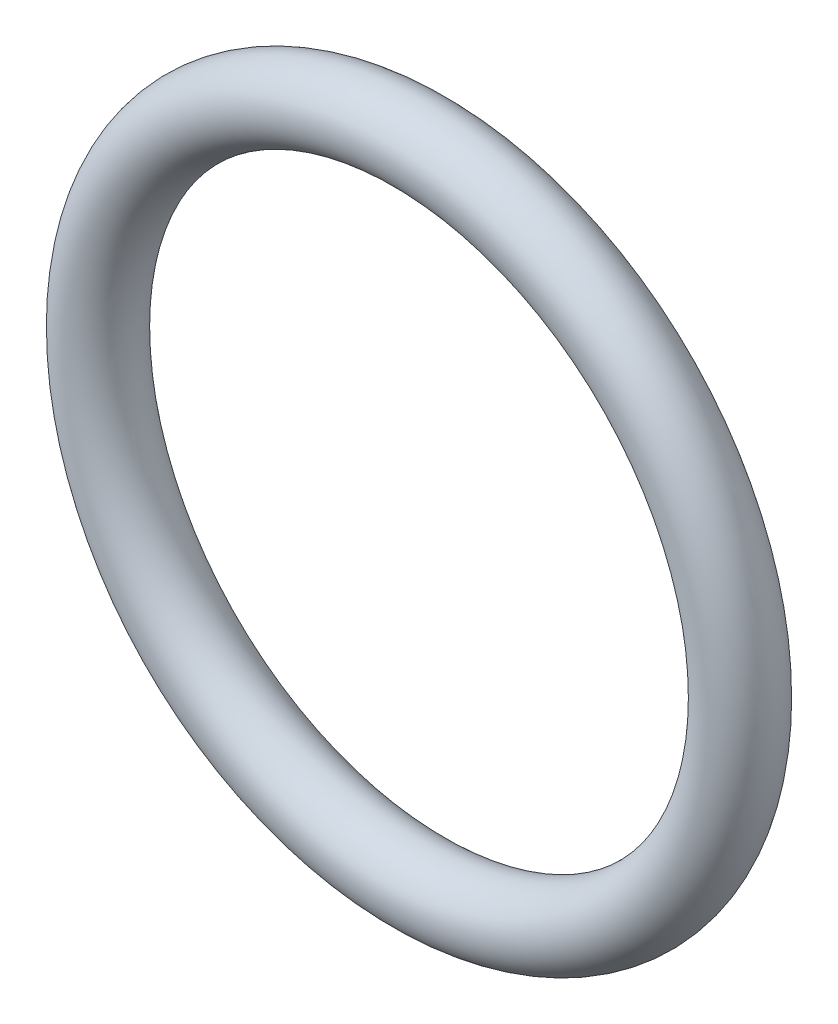
ISO-10303-21;
HEADER;
FILE_DESCRIPTION(('STEP AP214'),'2;1');
FILE_NAME('part.step','',(''),(''),'','','');
FILE_SCHEMA(('AUTOMOTIVE_DESIGN { 1 0 10303 214 1 1 1 1 }'));
ENDSEC;
DATA;
#1=APPLICATION_CONTEXT('core data for automotive mechanical design processes');
#2=APPLICATION_PROTOCOL_DEFINITION('international standard','automotive_design',2000,#1);
#3=PRODUCT_CONTEXT('',#1,'mechanical');
#4=PRODUCT('Part','Part','',(#3));
#5=PRODUCT_RELATED_PRODUCT_CATEGORY('part','',(#4));
#6=PRODUCT_DEFINITION_FORMATION('','',#4);
#7=PRODUCT_DEFINITION_CONTEXT('part definition',#1,'design');
#8=PRODUCT_DEFINITION('design','',#6,#7);
#9=PRODUCT_DEFINITION_SHAPE('','',#8);
#10=(LENGTH_UNIT() NAMED_UNIT(*) SI_UNIT(.MILLI.,.METRE.));
#11=(NAMED_UNIT(*) PLANE_ANGLE_UNIT() SI_UNIT($,.RADIAN.));
#12=(NAMED_UNIT(*) SI_UNIT($,.STERADIAN.) SOLID_ANGLE_UNIT());
#13=UNCERTAINTY_MEASURE_WITH_UNIT(LENGTH_MEASURE(1.E-05),#10,'distance_accuracy_value','');
#14=(GEOMETRIC_REPRESENTATION_CONTEXT(3) GLOBAL_UNCERTAINTY_ASSIGNED_CONTEXT((#13)) GLOBAL_UNIT_ASSIGNED_CONTEXT((#10,
#11,#12)) REPRESENTATION_CONTEXT('',''));
#15=CARTESIAN_POINT('',(0.,0.,0.));
#16=DIRECTION('',(0.,0.,1.));
#17=DIRECTION('',(1.,0.,0.));
#18=AXIS2_PLACEMENT_3D('',#15,#16,#17);
#19=CARTESIAN_POINT('',(0.,14.5,0.));
#20=DIRECTION('',(0.,0.,-1.));
#21=DIRECTION('',(-1.,0.,0.));
#22=AXIS2_PLACEMENT_3D('',#19,#20,#21);
#23=TOROIDAL_SURFACE('',#22,14.5,1.65);
#24=CARTESIAN_POINT('',(-16.15,14.5,0.));
#25=VERTEX_POINT('',#24);
#26=VERTEX_LOOP('',#25);
#27=FACE_BOUND('',#26,.T.);
#28=ADVANCED_FACE('F28',(#27),#23,.T.);
#29=CLOSED_SHELL('',(#28));
#30=MANIFOLD_SOLID_BREP('B2',#29);
#31=ADVANCED_BREP_SHAPE_REPRESENTATION('',(#18,#30),#14);
#32=SHAPE_DEFINITION_REPRESENTATION(#9,#31);
ENDSEC;
END-ISO-10303-21;
